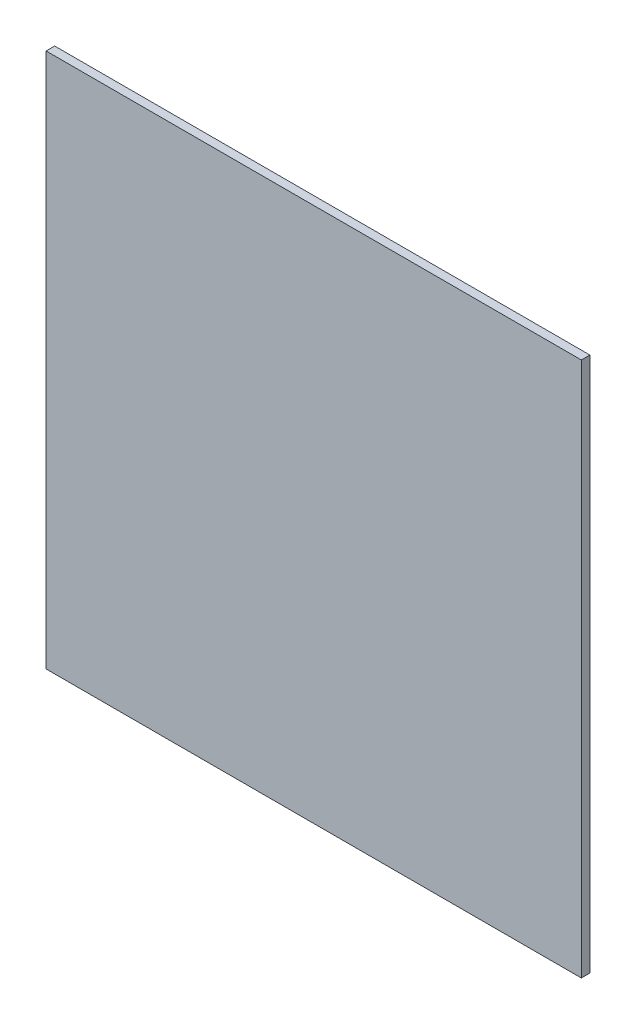
ISO-10303-21;
HEADER;
FILE_DESCRIPTION(('STEP AP214'),'2;1');
FILE_NAME('part.step','',(''),(''),'','','');
FILE_SCHEMA(('AUTOMOTIVE_DESIGN { 1 0 10303 214 1 1 1 1 }'));
ENDSEC;
DATA;
#1=APPLICATION_CONTEXT('core data for automotive mechanical design processes');
#2=APPLICATION_PROTOCOL_DEFINITION('international standard','automotive_design',2000,#1);
#3=PRODUCT_CONTEXT('',#1,'mechanical');
#4=PRODUCT('Part','Part','',(#3));
#5=PRODUCT_RELATED_PRODUCT_CATEGORY('part','',(#4));
#6=PRODUCT_DEFINITION_FORMATION('','',#4);
#7=PRODUCT_DEFINITION_CONTEXT('part definition',#1,'design');
#8=PRODUCT_DEFINITION('design','',#6,#7);
#9=PRODUCT_DEFINITION_SHAPE('','',#8);
#10=(LENGTH_UNIT() NAMED_UNIT(*) SI_UNIT(.MILLI.,.METRE.));
#11=(NAMED_UNIT(*) PLANE_ANGLE_UNIT() SI_UNIT($,.RADIAN.));
#12=(NAMED_UNIT(*) SI_UNIT($,.STERADIAN.) SOLID_ANGLE_UNIT());
#13=UNCERTAINTY_MEASURE_WITH_UNIT(LENGTH_MEASURE(1.E-05),#10,'distance_accuracy_value','');
#14=(GEOMETRIC_REPRESENTATION_CONTEXT(3) GLOBAL_UNCERTAINTY_ASSIGNED_CONTEXT((#13)) GLOBAL_UNIT_ASSIGNED_CONTEXT((#10,
#11,#12)) REPRESENTATION_CONTEXT('',''));
#15=CARTESIAN_POINT('',(0.,0.,0.));
#16=DIRECTION('',(0.,0.,1.));
#17=DIRECTION('',(1.,0.,0.));
#18=AXIS2_PLACEMENT_3D('',#15,#16,#17);
#19=CARTESIAN_POINT('',(62.5,-62.5,2.));
#20=DIRECTION('',(-1.,0.,0.));
#21=DIRECTION('',(0.,0.,1.));
#22=AXIS2_PLACEMENT_3D('',#19,#20,#21);
#23=PLANE('',#22);
#24=DIRECTION('',(0.,1.,0.));
#25=VECTOR('',#24,1.);
#26=CARTESIAN_POINT('',(62.5,-62.5,0.));
#27=LINE('',#26,#25);
#28=CARTESIAN_POINT('',(62.5,-62.5,0.));
#29=VERTEX_POINT('',#28);
#30=CARTESIAN_POINT('',(62.5,62.5,0.));
#31=VERTEX_POINT('',#30);
#32=EDGE_CURVE('E97',#29,#31,#27,.T.);
#33=ORIENTED_EDGE('',*,*,#32,.T.);
#34=DIRECTION('',(0.,0.,-1.));
#35=VECTOR('',#34,1.);
#36=CARTESIAN_POINT('',(62.5,62.5,2.));
#37=LINE('',#36,#35);
#38=CARTESIAN_POINT('',(62.5,62.5,2.));
#39=VERTEX_POINT('',#38);
#40=EDGE_CURVE('E11',#39,#31,#37,.T.);
#41=ORIENTED_EDGE('',*,*,#40,.F.);
#42=DIRECTION('',(0.,1.,0.));
#43=VECTOR('',#42,1.);
#44=CARTESIAN_POINT('',(62.5,-62.5,2.));
#45=LINE('',#44,#43);
#46=CARTESIAN_POINT('',(62.5,-62.5,2.));
#47=VERTEX_POINT('',#46);
#48=EDGE_CURVE('E85',#47,#39,#45,.T.);
#49=ORIENTED_EDGE('',*,*,#48,.F.);
#50=DIRECTION('',(0.,0.,-1.));
#51=VECTOR('',#50,1.);
#52=CARTESIAN_POINT('',(62.5,-62.5,2.));
#53=LINE('',#52,#51);
#54=EDGE_CURVE('E93',#47,#29,#53,.T.);
#55=ORIENTED_EDGE('',*,*,#54,.T.);
#56=EDGE_LOOP('',(#33,#41,#49,#55));
#57=FACE_BOUND('',#56,.T.);
#58=ADVANCED_FACE('F34',(#57),#23,.F.);
#59=CARTESIAN_POINT('',(-62.5,62.5,2.));
#60=DIRECTION('',(0.,-1.,0.));
#61=DIRECTION('',(0.,0.,-1.));
#62=AXIS2_PLACEMENT_3D('',#59,#60,#61);
#63=PLANE('',#62);
#64=DIRECTION('',(-1.,0.,0.));
#65=VECTOR('',#64,1.);
#66=CARTESIAN_POINT('',(-62.5,62.5,0.));
#67=LINE('',#66,#65);
#68=CARTESIAN_POINT('',(-62.5,62.5,0.));
#69=VERTEX_POINT('',#68);
#70=EDGE_CURVE('E89',#31,#69,#67,.T.);
#71=ORIENTED_EDGE('',*,*,#70,.T.);
#72=DIRECTION('',(0.,0.,-1.));
#73=VECTOR('',#72,1.);
#74=CARTESIAN_POINT('',(-62.5,62.5,2.));
#75=LINE('',#74,#73);
#76=CARTESIAN_POINT('',(-62.5,62.5,2.));
#77=VERTEX_POINT('',#76);
#78=EDGE_CURVE('E42',#77,#69,#75,.T.);
#79=ORIENTED_EDGE('',*,*,#78,.F.);
#80=DIRECTION('',(-1.,0.,0.));
#81=VECTOR('',#80,1.);
#82=CARTESIAN_POINT('',(-62.5,62.5,2.));
#83=LINE('',#82,#81);
#84=EDGE_CURVE('E80',#39,#77,#83,.T.);
#85=ORIENTED_EDGE('',*,*,#84,.F.);
#86=ORIENTED_EDGE('',*,*,#40,.T.);
#87=EDGE_LOOP('',(#71,#79,#85,#86));
#88=FACE_BOUND('',#87,.T.);
#89=ADVANCED_FACE('F88',(#88),#63,.F.);
#90=CARTESIAN_POINT('',(-62.5,-62.5,2.));
#91=DIRECTION('',(1.,0.,0.));
#92=DIRECTION('',(0.,0.,-1.));
#93=AXIS2_PLACEMENT_3D('',#90,#91,#92);
#94=PLANE('',#93);
#95=DIRECTION('',(0.,-1.,0.));
#96=VECTOR('',#95,1.);
#97=CARTESIAN_POINT('',(-62.5,-62.5,0.));
#98=LINE('',#97,#96);
#99=CARTESIAN_POINT('',(-62.5,-62.5,0.));
#100=VERTEX_POINT('',#99);
#101=EDGE_CURVE('E67',#69,#100,#98,.T.);
#102=ORIENTED_EDGE('',*,*,#101,.T.);
#103=DIRECTION('',(0.,0.,-1.));
#104=VECTOR('',#103,1.);
#105=CARTESIAN_POINT('',(-62.5,-62.5,2.));
#106=LINE('',#105,#104);
#107=CARTESIAN_POINT('',(-62.5,-62.5,2.));
#108=VERTEX_POINT('',#107);
#109=EDGE_CURVE('E90',#108,#100,#106,.T.);
#110=ORIENTED_EDGE('',*,*,#109,.F.);
#111=DIRECTION('',(0.,-1.,0.));
#112=VECTOR('',#111,1.);
#113=CARTESIAN_POINT('',(-62.5,-62.5,2.));
#114=LINE('',#113,#112);
#115=EDGE_CURVE('E83',#77,#108,#114,.T.);
#116=ORIENTED_EDGE('',*,*,#115,.F.);
#117=ORIENTED_EDGE('',*,*,#78,.T.);
#118=EDGE_LOOP('',(#102,#110,#116,#117));
#119=FACE_BOUND('',#118,.T.);
#120=ADVANCED_FACE('F91',(#119),#94,.F.);
#121=CARTESIAN_POINT('',(-62.5,-62.5,2.));
#122=DIRECTION('',(0.,1.,0.));
#123=DIRECTION('',(0.,0.,1.));
#124=AXIS2_PLACEMENT_3D('',#121,#122,#123);
#125=PLANE('',#124);
#126=DIRECTION('',(1.,0.,0.));
#127=VECTOR('',#126,1.);
#128=CARTESIAN_POINT('',(-62.5,-62.5,0.));
#129=LINE('',#128,#127);
#130=EDGE_CURVE('E73',#100,#29,#129,.T.);
#131=ORIENTED_EDGE('',*,*,#130,.T.);
#132=ORIENTED_EDGE('',*,*,#54,.F.);
#133=DIRECTION('',(1.,0.,0.));
#134=VECTOR('',#133,1.);
#135=CARTESIAN_POINT('',(-62.5,-62.5,2.));
#136=LINE('',#135,#134);
#137=EDGE_CURVE('E50',#108,#47,#136,.T.);
#138=ORIENTED_EDGE('',*,*,#137,.F.);
#139=ORIENTED_EDGE('',*,*,#109,.T.);
#140=EDGE_LOOP('',(#131,#132,#138,#139));
#141=FACE_BOUND('',#140,.T.);
#142=ADVANCED_FACE('F104',(#141),#125,.F.);
#143=CARTESIAN_POINT('',(0.,0.,2.));
#144=DIRECTION('',(0.,0.,-1.));
#145=DIRECTION('',(-1.,0.,0.));
#146=AXIS2_PLACEMENT_3D('',#143,#144,#145);
#147=PLANE('',#146);
#148=ORIENTED_EDGE('',*,*,#48,.T.);
#149=ORIENTED_EDGE('',*,*,#84,.T.);
#150=ORIENTED_EDGE('',*,*,#115,.T.);
#151=ORIENTED_EDGE('',*,*,#137,.T.);
#152=EDGE_LOOP('',(#148,#149,#150,#151));
#153=FACE_BOUND('',#152,.T.);
#154=ADVANCED_FACE('F81',(#153),#147,.F.);
#155=CARTESIAN_POINT('',(0.,0.,0.));
#156=DIRECTION('',(0.,0.,-1.));
#157=DIRECTION('',(-1.,0.,0.));
#158=AXIS2_PLACEMENT_3D('',#155,#156,#157);
#159=PLANE('',#158);
#160=ORIENTED_EDGE('',*,*,#32,.F.);
#161=ORIENTED_EDGE('',*,*,#130,.F.);
#162=ORIENTED_EDGE('',*,*,#101,.F.);
#163=ORIENTED_EDGE('',*,*,#70,.F.);
#164=EDGE_LOOP('',(#160,#161,#162,#163));
#165=FACE_BOUND('',#164,.T.);
#166=ADVANCED_FACE('F107',(#165),#159,.T.);
#167=CLOSED_SHELL('',(#58,#89,#120,#142,#154,#166));
#168=MANIFOLD_SOLID_BREP('B2',#167);
#169=ADVANCED_BREP_SHAPE_REPRESENTATION('',(#18,#168),#14);
#170=SHAPE_DEFINITION_REPRESENTATION(#9,#169);
ENDSEC;
END-ISO-10303-21;
